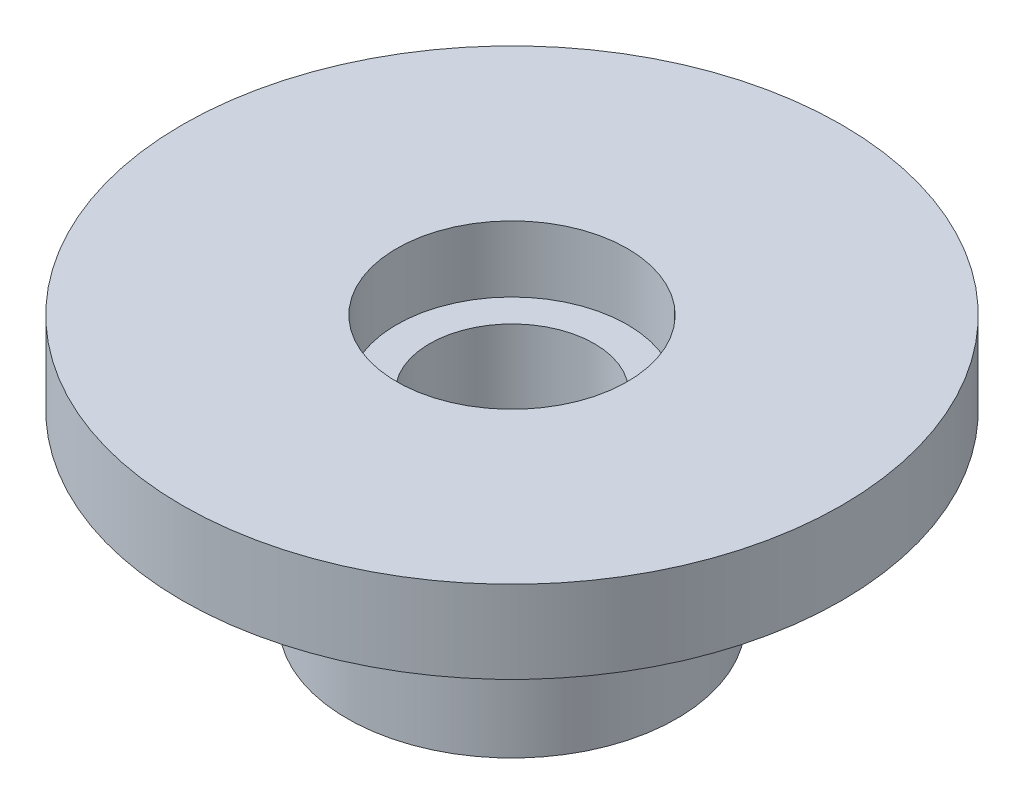
ISO-10303-21;
HEADER;
FILE_DESCRIPTION(('STEP AP214'),'2;1');
FILE_NAME('part.step','',(''),(''),'','','');
FILE_SCHEMA(('AUTOMOTIVE_DESIGN { 1 0 10303 214 1 1 1 1 }'));
ENDSEC;
DATA;
#1=APPLICATION_CONTEXT('core data for automotive mechanical design processes');
#2=APPLICATION_PROTOCOL_DEFINITION('international standard','automotive_design',2000,#1);
#3=PRODUCT_CONTEXT('',#1,'mechanical');
#4=PRODUCT('Part','Part','',(#3));
#5=PRODUCT_RELATED_PRODUCT_CATEGORY('part','',(#4));
#6=PRODUCT_DEFINITION_FORMATION('','',#4);
#7=PRODUCT_DEFINITION_CONTEXT('part definition',#1,'design');
#8=PRODUCT_DEFINITION('design','',#6,#7);
#9=PRODUCT_DEFINITION_SHAPE('','',#8);
#10=(LENGTH_UNIT() NAMED_UNIT(*) SI_UNIT(.MILLI.,.METRE.));
#11=(NAMED_UNIT(*) PLANE_ANGLE_UNIT() SI_UNIT($,.RADIAN.));
#12=(NAMED_UNIT(*) SI_UNIT($,.STERADIAN.) SOLID_ANGLE_UNIT());
#13=UNCERTAINTY_MEASURE_WITH_UNIT(LENGTH_MEASURE(1.E-05),#10,'distance_accuracy_value','');
#14=(GEOMETRIC_REPRESENTATION_CONTEXT(3) GLOBAL_UNCERTAINTY_ASSIGNED_CONTEXT((#13)) GLOBAL_UNIT_ASSIGNED_CONTEXT((#10,
#11,#12)) REPRESENTATION_CONTEXT('',''));
#15=CARTESIAN_POINT('',(0.,0.,0.));
#16=DIRECTION('',(0.,0.,1.));
#17=DIRECTION('',(1.,0.,0.));
#18=AXIS2_PLACEMENT_3D('',#15,#16,#17);
#19=CARTESIAN_POINT('',(0.,0.,0.));
#20=DIRECTION('',(0.,-1.,0.));
#21=DIRECTION('',(0.,0.,-1.));
#22=AXIS2_PLACEMENT_3D('',#19,#20,#21);
#23=CYLINDRICAL_SURFACE('',#22,2.5);
#24=CARTESIAN_POINT('',(0.,0.,0.));
#25=DIRECTION('',(0.,-1.,0.));
#26=DIRECTION('',(0.,0.,-1.));
#27=AXIS2_PLACEMENT_3D('',#24,#25,#26);
#28=CIRCLE('',#27,2.5);
#29=CARTESIAN_POINT('',(0.,0.,-2.5));
#30=VERTEX_POINT('',#29);
#31=EDGE_CURVE('E67',#30,#30,#28,.T.);
#32=ORIENTED_EDGE('',*,*,#31,.T.);
#33=EDGE_LOOP('',(#32));
#34=FACE_BOUND('',#33,.T.);
#35=CARTESIAN_POINT('',(0.,6.1,0.));
#36=DIRECTION('',(0.,-1.,0.));
#37=DIRECTION('',(0.,0.,-1.));
#38=AXIS2_PLACEMENT_3D('',#35,#36,#37);
#39=CIRCLE('',#38,2.5);
#40=CARTESIAN_POINT('',(0.,6.1,-2.5));
#41=VERTEX_POINT('',#40);
#42=EDGE_CURVE('E10',#41,#41,#39,.T.);
#43=ORIENTED_EDGE('',*,*,#42,.F.);
#44=EDGE_LOOP('',(#43));
#45=FACE_BOUND('',#44,.T.);
#46=ADVANCED_FACE('F39',(#34,#45),#23,.F.);
#47=CARTESIAN_POINT('',(2.5,6.1,0.));
#48=DIRECTION('',(0.,1.,0.));
#49=DIRECTION('',(0.,0.,1.));
#50=AXIS2_PLACEMENT_3D('',#47,#48,#49);
#51=PLANE('',#50);
#52=ORIENTED_EDGE('',*,*,#42,.T.);
#53=EDGE_LOOP('',(#52));
#54=FACE_BOUND('',#53,.T.);
#55=CARTESIAN_POINT('',(0.,6.1,0.));
#56=DIRECTION('',(0.,-1.,0.));
#57=DIRECTION('',(0.,0.,-1.));
#58=AXIS2_PLACEMENT_3D('',#55,#56,#57);
#59=CIRCLE('',#58,3.5);
#60=CARTESIAN_POINT('',(0.,6.1,-3.5));
#61=VERTEX_POINT('',#60);
#62=EDGE_CURVE('E45',#61,#61,#59,.T.);
#63=ORIENTED_EDGE('',*,*,#62,.F.);
#64=EDGE_LOOP('',(#63));
#65=FACE_BOUND('',#64,.T.);
#66=ADVANCED_FACE('F85',(#54,#65),#51,.T.);
#67=CARTESIAN_POINT('',(0.,0.,0.));
#68=DIRECTION('',(0.,-1.,0.));
#69=DIRECTION('',(0.,0.,-1.));
#70=AXIS2_PLACEMENT_3D('',#67,#68,#69);
#71=CYLINDRICAL_SURFACE('',#70,3.5);
#72=ORIENTED_EDGE('',*,*,#62,.T.);
#73=EDGE_LOOP('',(#72));
#74=FACE_BOUND('',#73,.T.);
#75=CARTESIAN_POINT('',(0.,8.1,0.));
#76=DIRECTION('',(0.,-1.,0.));
#77=DIRECTION('',(0.,0.,-1.));
#78=AXIS2_PLACEMENT_3D('',#75,#76,#77);
#79=CIRCLE('',#78,3.5);
#80=CARTESIAN_POINT('',(0.,8.1,-3.5));
#81=VERTEX_POINT('',#80);
#82=EDGE_CURVE('E49',#81,#81,#79,.T.);
#83=ORIENTED_EDGE('',*,*,#82,.F.);
#84=EDGE_LOOP('',(#83));
#85=FACE_BOUND('',#84,.T.);
#86=ADVANCED_FACE('F89',(#74,#85),#71,.F.);
#87=CARTESIAN_POINT('',(3.5,8.1,0.));
#88=DIRECTION('',(0.,1.,0.));
#89=DIRECTION('',(0.,0.,1.));
#90=AXIS2_PLACEMENT_3D('',#87,#88,#89);
#91=PLANE('',#90);
#92=ORIENTED_EDGE('',*,*,#82,.T.);
#93=EDGE_LOOP('',(#92));
#94=FACE_BOUND('',#93,.T.);
#95=CARTESIAN_POINT('',(0.,8.1,0.));
#96=DIRECTION('',(0.,-1.,0.));
#97=DIRECTION('',(0.,0.,-1.));
#98=AXIS2_PLACEMENT_3D('',#95,#96,#97);
#99=CIRCLE('',#98,10.);
#100=CARTESIAN_POINT('',(0.,8.1,-10.));
#101=VERTEX_POINT('',#100);
#102=EDGE_CURVE('E53',#101,#101,#99,.T.);
#103=ORIENTED_EDGE('',*,*,#102,.F.);
#104=EDGE_LOOP('',(#103));
#105=FACE_BOUND('',#104,.T.);
#106=ADVANCED_FACE('F93',(#94,#105),#91,.T.);
#107=CARTESIAN_POINT('',(0.,0.,0.));
#108=DIRECTION('',(0.,-1.,0.));
#109=DIRECTION('',(0.,0.,-1.));
#110=AXIS2_PLACEMENT_3D('',#107,#108,#109);
#111=CYLINDRICAL_SURFACE('',#110,10.);
#112=ORIENTED_EDGE('',*,*,#102,.T.);
#113=EDGE_LOOP('',(#112));
#114=FACE_BOUND('',#113,.T.);
#115=CARTESIAN_POINT('',(0.,5.6,0.));
#116=DIRECTION('',(0.,-1.,0.));
#117=DIRECTION('',(0.,0.,-1.));
#118=AXIS2_PLACEMENT_3D('',#115,#116,#117);
#119=CIRCLE('',#118,10.);
#120=CARTESIAN_POINT('',(0.,5.6,-10.));
#121=VERTEX_POINT('',#120);
#122=EDGE_CURVE('E58',#121,#121,#119,.T.);
#123=ORIENTED_EDGE('',*,*,#122,.F.);
#124=EDGE_LOOP('',(#123));
#125=FACE_BOUND('',#124,.T.);
#126=ADVANCED_FACE('F99',(#114,#125),#111,.T.);
#127=CARTESIAN_POINT('',(10.,5.6,0.));
#128=DIRECTION('',(0.,-1.,0.));
#129=DIRECTION('',(0.,0.,-1.));
#130=AXIS2_PLACEMENT_3D('',#127,#128,#129);
#131=PLANE('',#130);
#132=ORIENTED_EDGE('',*,*,#122,.T.);
#133=EDGE_LOOP('',(#132));
#134=FACE_BOUND('',#133,.T.);
#135=CARTESIAN_POINT('',(0.,5.6,0.));
#136=DIRECTION('',(0.,-1.,0.));
#137=DIRECTION('',(0.,0.,-1.));
#138=AXIS2_PLACEMENT_3D('',#135,#136,#137);
#139=CIRCLE('',#138,5.);
#140=CARTESIAN_POINT('',(0.,5.6,-5.));
#141=VERTEX_POINT('',#140);
#142=EDGE_CURVE('E61',#141,#141,#139,.T.);
#143=ORIENTED_EDGE('',*,*,#142,.F.);
#144=EDGE_LOOP('',(#143));
#145=FACE_BOUND('',#144,.T.);
#146=ADVANCED_FACE('F81',(#134,#145),#131,.T.);
#147=CARTESIAN_POINT('',(0.,0.,0.));
#148=DIRECTION('',(0.,-1.,0.));
#149=DIRECTION('',(0.,0.,-1.));
#150=AXIS2_PLACEMENT_3D('',#147,#148,#149);
#151=CYLINDRICAL_SURFACE('',#150,5.);
#152=ORIENTED_EDGE('',*,*,#142,.T.);
#153=EDGE_LOOP('',(#152));
#154=FACE_BOUND('',#153,.T.);
#155=CARTESIAN_POINT('',(0.,0.,0.));
#156=DIRECTION('',(0.,-1.,0.));
#157=DIRECTION('',(0.,0.,-1.));
#158=AXIS2_PLACEMENT_3D('',#155,#156,#157);
#159=CIRCLE('',#158,5.);
#160=CARTESIAN_POINT('',(0.,0.,-5.));
#161=VERTEX_POINT('',#160);
#162=EDGE_CURVE('E64',#161,#161,#159,.T.);
#163=ORIENTED_EDGE('',*,*,#162,.F.);
#164=EDGE_LOOP('',(#163));
#165=FACE_BOUND('',#164,.T.);
#166=ADVANCED_FACE('F75',(#154,#165),#151,.T.);
#167=CARTESIAN_POINT('',(5.,0.,0.));
#168=DIRECTION('',(0.,-1.,0.));
#169=DIRECTION('',(0.,0.,-1.));
#170=AXIS2_PLACEMENT_3D('',#167,#168,#169);
#171=PLANE('',#170);
#172=ORIENTED_EDGE('',*,*,#162,.T.);
#173=EDGE_LOOP('',(#172));
#174=FACE_BOUND('',#173,.T.);
#175=ORIENTED_EDGE('',*,*,#31,.F.);
#176=EDGE_LOOP('',(#175));
#177=FACE_BOUND('',#176,.T.);
#178=ADVANCED_FACE('F73',(#174,#177),#171,.T.);
#179=CLOSED_SHELL('',(#46,#66,#86,#106,#126,#146,#166,#178));
#180=MANIFOLD_SOLID_BREP('B2',#179);
#181=ADVANCED_BREP_SHAPE_REPRESENTATION('',(#18,#180),#14);
#182=SHAPE_DEFINITION_REPRESENTATION(#9,#181);
ENDSEC;
END-ISO-10303-21;
